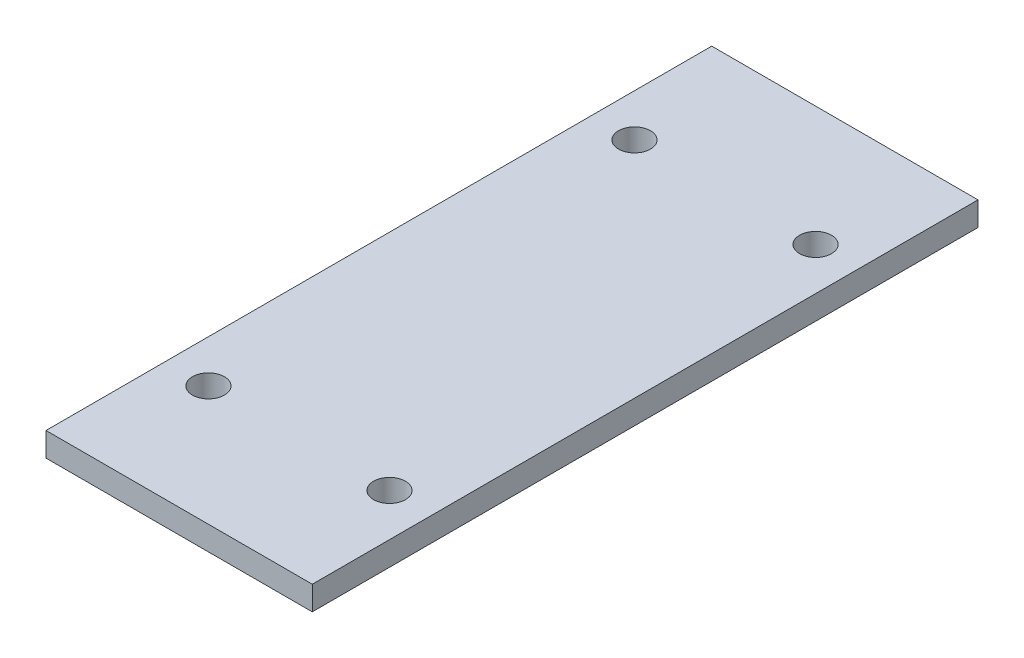
ISO-10303-21;
HEADER;
FILE_DESCRIPTION(('STEP AP214'),'2;1');
FILE_NAME('part.step','',(''),(''),'','','');
FILE_SCHEMA(('AUTOMOTIVE_DESIGN { 1 0 10303 214 1 1 1 1 }'));
ENDSEC;
DATA;
#1=APPLICATION_CONTEXT('core data for automotive mechanical design processes');
#2=APPLICATION_PROTOCOL_DEFINITION('international standard','automotive_design',2000,#1);
#3=PRODUCT_CONTEXT('',#1,'mechanical');
#4=PRODUCT('Part','Part','',(#3));
#5=PRODUCT_RELATED_PRODUCT_CATEGORY('part','',(#4));
#6=PRODUCT_DEFINITION_FORMATION('','',#4);
#7=PRODUCT_DEFINITION_CONTEXT('part definition',#1,'design');
#8=PRODUCT_DEFINITION('design','',#6,#7);
#9=PRODUCT_DEFINITION_SHAPE('','',#8);
#10=(LENGTH_UNIT() NAMED_UNIT(*) SI_UNIT(.MILLI.,.METRE.));
#11=(NAMED_UNIT(*) PLANE_ANGLE_UNIT() SI_UNIT($,.RADIAN.));
#12=(NAMED_UNIT(*) SI_UNIT($,.STERADIAN.) SOLID_ANGLE_UNIT());
#13=UNCERTAINTY_MEASURE_WITH_UNIT(LENGTH_MEASURE(1.E-05),#10,'distance_accuracy_value','');
#14=(GEOMETRIC_REPRESENTATION_CONTEXT(3) GLOBAL_UNCERTAINTY_ASSIGNED_CONTEXT((#13)) GLOBAL_UNIT_ASSIGNED_CONTEXT((#10,
#11,#12)) REPRESENTATION_CONTEXT('',''));
#15=CARTESIAN_POINT('',(0.,0.,0.));
#16=DIRECTION('',(0.,0.,1.));
#17=DIRECTION('',(1.,0.,0.));
#18=AXIS2_PLACEMENT_3D('',#15,#16,#17);
#19=CARTESIAN_POINT('',(0.,0.,250.));
#20=DIRECTION('',(1.,0.,0.));
#21=DIRECTION('',(0.,0.,-1.));
#22=AXIS2_PLACEMENT_3D('',#19,#20,#21);
#23=PLANE('',#22);
#24=DIRECTION('',(0.,-1.,0.));
#25=VECTOR('',#24,1.);
#26=CARTESIAN_POINT('',(0.,0.,0.));
#27=LINE('',#26,#25);
#28=CARTESIAN_POINT('',(0.,0.,0.));
#29=VERTEX_POINT('',#28);
#30=CARTESIAN_POINT('',(0.,-9.,0.));
#31=VERTEX_POINT('',#30);
#32=EDGE_CURVE('E107',#29,#31,#27,.T.);
#33=ORIENTED_EDGE('',*,*,#32,.T.);
#34=DIRECTION('',(0.,0.,-1.));
#35=VECTOR('',#34,1.);
#36=CARTESIAN_POINT('',(0.,-9.,250.));
#37=LINE('',#36,#35);
#38=CARTESIAN_POINT('',(0.,-9.,250.));
#39=VERTEX_POINT('',#38);
#40=EDGE_CURVE('E11',#39,#31,#37,.T.);
#41=ORIENTED_EDGE('',*,*,#40,.F.);
#42=DIRECTION('',(0.,-1.,0.));
#43=VECTOR('',#42,1.);
#44=CARTESIAN_POINT('',(0.,0.,250.));
#45=LINE('',#44,#43);
#46=CARTESIAN_POINT('',(0.,0.,250.));
#47=VERTEX_POINT('',#46);
#48=EDGE_CURVE('E89',#47,#39,#45,.T.);
#49=ORIENTED_EDGE('',*,*,#48,.F.);
#50=DIRECTION('',(0.,0.,-1.));
#51=VECTOR('',#50,1.);
#52=CARTESIAN_POINT('',(0.,0.,250.));
#53=LINE('',#52,#51);
#54=EDGE_CURVE('E56',#47,#29,#53,.T.);
#55=ORIENTED_EDGE('',*,*,#54,.T.);
#56=EDGE_LOOP('',(#33,#41,#49,#55));
#57=FACE_BOUND('',#56,.T.);
#58=ADVANCED_FACE('F39',(#57),#23,.F.);
#59=CARTESIAN_POINT('',(0.,-9.,250.));
#60=DIRECTION('',(0.,1.,0.));
#61=DIRECTION('',(0.,0.,1.));
#62=AXIS2_PLACEMENT_3D('',#59,#60,#61);
#63=PLANE('',#62);
#64=CARTESIAN_POINT('',(84.,-9.,45.));
#65=DIRECTION('',(0.,1.,0.));
#66=DIRECTION('',(0.,0.,1.));
#67=AXIS2_PLACEMENT_3D('',#64,#65,#66);
#68=CIRCLE('',#67,6.);
#69=CARTESIAN_POINT('',(84.,-9.,51.));
#70=VERTEX_POINT('',#69);
#71=EDGE_CURVE('E130',#70,#70,#68,.T.);
#72=ORIENTED_EDGE('',*,*,#71,.T.);
#73=EDGE_LOOP('',(#72));
#74=FACE_BOUND('',#73,.T.);
#75=CARTESIAN_POINT('',(16.,-9.,205.));
#76=DIRECTION('',(0.,1.,0.));
#77=DIRECTION('',(0.,0.,1.));
#78=AXIS2_PLACEMENT_3D('',#75,#76,#77);
#79=CIRCLE('',#78,6.);
#80=CARTESIAN_POINT('',(16.,-9.,211.));
#81=VERTEX_POINT('',#80);
#82=EDGE_CURVE('E138',#81,#81,#79,.T.);
#83=ORIENTED_EDGE('',*,*,#82,.T.);
#84=EDGE_LOOP('',(#83));
#85=FACE_BOUND('',#84,.T.);
#86=CARTESIAN_POINT('',(84.,-9.,205.));
#87=DIRECTION('',(0.,1.,0.));
#88=DIRECTION('',(0.,0.,1.));
#89=AXIS2_PLACEMENT_3D('',#86,#87,#88);
#90=CIRCLE('',#89,6.);
#91=CARTESIAN_POINT('',(84.,-9.,211.));
#92=VERTEX_POINT('',#91);
#93=EDGE_CURVE('E139',#92,#92,#90,.T.);
#94=ORIENTED_EDGE('',*,*,#93,.T.);
#95=EDGE_LOOP('',(#94));
#96=FACE_BOUND('',#95,.T.);
#97=CARTESIAN_POINT('',(16.,-9.,45.));
#98=DIRECTION('',(0.,1.,0.));
#99=DIRECTION('',(0.,0.,1.));
#100=AXIS2_PLACEMENT_3D('',#97,#98,#99);
#101=CIRCLE('',#100,6.);
#102=CARTESIAN_POINT('',(16.,-9.,51.));
#103=VERTEX_POINT('',#102);
#104=EDGE_CURVE('E110',#103,#103,#101,.T.);
#105=ORIENTED_EDGE('',*,*,#104,.T.);
#106=EDGE_LOOP('',(#105));
#107=FACE_BOUND('',#106,.T.);
#108=DIRECTION('',(1.,0.,0.));
#109=VECTOR('',#108,1.);
#110=CARTESIAN_POINT('',(0.,-9.,0.));
#111=LINE('',#110,#109);
#112=CARTESIAN_POINT('',(100.,-9.,0.));
#113=VERTEX_POINT('',#112);
#114=EDGE_CURVE('E95',#31,#113,#111,.T.);
#115=ORIENTED_EDGE('',*,*,#114,.T.);
#116=DIRECTION('',(0.,0.,-1.));
#117=VECTOR('',#116,1.);
#118=CARTESIAN_POINT('',(100.,-9.,250.));
#119=LINE('',#118,#117);
#120=CARTESIAN_POINT('',(100.,-9.,250.));
#121=VERTEX_POINT('',#120);
#122=EDGE_CURVE('E48',#121,#113,#119,.T.);
#123=ORIENTED_EDGE('',*,*,#122,.F.);
#124=DIRECTION('',(1.,0.,0.));
#125=VECTOR('',#124,1.);
#126=CARTESIAN_POINT('',(0.,-9.,250.));
#127=LINE('',#126,#125);
#128=EDGE_CURVE('E81',#39,#121,#127,.T.);
#129=ORIENTED_EDGE('',*,*,#128,.F.);
#130=ORIENTED_EDGE('',*,*,#40,.T.);
#131=EDGE_LOOP('',(#115,#123,#129,#130));
#132=FACE_BOUND('',#131,.T.);
#133=ADVANCED_FACE('F94',(#74,#85,#96,#107,#132),#63,.F.);
#134=CARTESIAN_POINT('',(100.,0.,250.));
#135=DIRECTION('',(1.,0.,0.));
#136=DIRECTION('',(0.,0.,-1.));
#137=AXIS2_PLACEMENT_3D('',#134,#135,#136);
#138=PLANE('',#137);
#139=DIRECTION('',(0.,-1.,0.));
#140=VECTOR('',#139,1.);
#141=CARTESIAN_POINT('',(100.,0.,0.));
#142=LINE('',#141,#140);
#143=CARTESIAN_POINT('',(100.,0.,0.));
#144=VERTEX_POINT('',#143);
#145=EDGE_CURVE('E113',#144,#113,#142,.T.);
#146=ORIENTED_EDGE('',*,*,#145,.F.);
#147=DIRECTION('',(0.,0.,-1.));
#148=VECTOR('',#147,1.);
#149=CARTESIAN_POINT('',(100.,0.,250.));
#150=LINE('',#149,#148);
#151=CARTESIAN_POINT('',(100.,0.,250.));
#152=VERTEX_POINT('',#151);
#153=EDGE_CURVE('E70',#152,#144,#150,.T.);
#154=ORIENTED_EDGE('',*,*,#153,.F.);
#155=DIRECTION('',(0.,-1.,0.));
#156=VECTOR('',#155,1.);
#157=CARTESIAN_POINT('',(100.,0.,250.));
#158=LINE('',#157,#156);
#159=EDGE_CURVE('E88',#152,#121,#158,.T.);
#160=ORIENTED_EDGE('',*,*,#159,.T.);
#161=ORIENTED_EDGE('',*,*,#122,.T.);
#162=EDGE_LOOP('',(#146,#154,#160,#161));
#163=FACE_BOUND('',#162,.T.);
#164=ADVANCED_FACE('F99',(#163),#138,.T.);
#165=CARTESIAN_POINT('',(0.,0.,250.));
#166=DIRECTION('',(0.,1.,0.));
#167=DIRECTION('',(0.,0.,1.));
#168=AXIS2_PLACEMENT_3D('',#165,#166,#167);
#169=PLANE('',#168);
#170=CARTESIAN_POINT('',(84.,0.,45.));
#171=DIRECTION('',(0.,1.,0.));
#172=DIRECTION('',(0.,0.,1.));
#173=AXIS2_PLACEMENT_3D('',#170,#171,#172);
#174=CIRCLE('',#173,6.);
#175=CARTESIAN_POINT('',(84.,0.,51.));
#176=VERTEX_POINT('',#175);
#177=EDGE_CURVE('E143',#176,#176,#174,.T.);
#178=ORIENTED_EDGE('',*,*,#177,.F.);
#179=EDGE_LOOP('',(#178));
#180=FACE_BOUND('',#179,.T.);
#181=CARTESIAN_POINT('',(16.,0.,205.));
#182=DIRECTION('',(0.,1.,0.));
#183=DIRECTION('',(0.,0.,1.));
#184=AXIS2_PLACEMENT_3D('',#181,#182,#183);
#185=CIRCLE('',#184,6.);
#186=CARTESIAN_POINT('',(16.,0.,211.));
#187=VERTEX_POINT('',#186);
#188=EDGE_CURVE('E134',#187,#187,#185,.T.);
#189=ORIENTED_EDGE('',*,*,#188,.F.);
#190=EDGE_LOOP('',(#189));
#191=FACE_BOUND('',#190,.T.);
#192=CARTESIAN_POINT('',(84.,0.,205.));
#193=DIRECTION('',(0.,1.,0.));
#194=DIRECTION('',(0.,0.,1.));
#195=AXIS2_PLACEMENT_3D('',#192,#193,#194);
#196=CIRCLE('',#195,6.);
#197=CARTESIAN_POINT('',(84.,0.,211.));
#198=VERTEX_POINT('',#197);
#199=EDGE_CURVE('E150',#198,#198,#196,.T.);
#200=ORIENTED_EDGE('',*,*,#199,.F.);
#201=EDGE_LOOP('',(#200));
#202=FACE_BOUND('',#201,.T.);
#203=CARTESIAN_POINT('',(16.,0.,45.));
#204=DIRECTION('',(0.,1.,0.));
#205=DIRECTION('',(0.,0.,1.));
#206=AXIS2_PLACEMENT_3D('',#203,#204,#205);
#207=CIRCLE('',#206,6.);
#208=CARTESIAN_POINT('',(16.,0.,51.));
#209=VERTEX_POINT('',#208);
#210=EDGE_CURVE('E126',#209,#209,#207,.T.);
#211=ORIENTED_EDGE('',*,*,#210,.F.);
#212=EDGE_LOOP('',(#211));
#213=FACE_BOUND('',#212,.T.);
#214=DIRECTION('',(1.,0.,0.));
#215=VECTOR('',#214,1.);
#216=CARTESIAN_POINT('',(0.,0.,0.));
#217=LINE('',#216,#215);
#218=EDGE_CURVE('E116',#29,#144,#217,.T.);
#219=ORIENTED_EDGE('',*,*,#218,.F.);
#220=ORIENTED_EDGE('',*,*,#54,.F.);
#221=DIRECTION('',(1.,0.,0.));
#222=VECTOR('',#221,1.);
#223=CARTESIAN_POINT('',(0.,0.,250.));
#224=LINE('',#223,#222);
#225=EDGE_CURVE('E101',#47,#152,#224,.T.);
#226=ORIENTED_EDGE('',*,*,#225,.T.);
#227=ORIENTED_EDGE('',*,*,#153,.T.);
#228=EDGE_LOOP('',(#219,#220,#226,#227));
#229=FACE_BOUND('',#228,.T.);
#230=ADVANCED_FACE('F168',(#180,#191,#202,#213,#229),#169,.T.);
#231=CARTESIAN_POINT('',(0.,0.,250.));
#232=DIRECTION('',(0.,0.,1.));
#233=DIRECTION('',(1.,0.,0.));
#234=AXIS2_PLACEMENT_3D('',#231,#232,#233);
#235=PLANE('',#234);
#236=ORIENTED_EDGE('',*,*,#48,.T.);
#237=ORIENTED_EDGE('',*,*,#128,.T.);
#238=ORIENTED_EDGE('',*,*,#159,.F.);
#239=ORIENTED_EDGE('',*,*,#225,.F.);
#240=EDGE_LOOP('',(#236,#237,#238,#239));
#241=FACE_BOUND('',#240,.T.);
#242=ADVANCED_FACE('F85',(#241),#235,.T.);
#243=CARTESIAN_POINT('',(0.,0.,0.));
#244=DIRECTION('',(0.,0.,1.));
#245=DIRECTION('',(1.,0.,0.));
#246=AXIS2_PLACEMENT_3D('',#243,#244,#245);
#247=PLANE('',#246);
#248=ORIENTED_EDGE('',*,*,#32,.F.);
#249=ORIENTED_EDGE('',*,*,#218,.T.);
#250=ORIENTED_EDGE('',*,*,#145,.T.);
#251=ORIENTED_EDGE('',*,*,#114,.F.);
#252=EDGE_LOOP('',(#248,#249,#250,#251));
#253=FACE_BOUND('',#252,.T.);
#254=ADVANCED_FACE('F176',(#253),#247,.F.);
#255=CARTESIAN_POINT('',(16.,-9.,45.));
#256=DIRECTION('',(0.,1.,0.));
#257=DIRECTION('',(0.,0.,1.));
#258=AXIS2_PLACEMENT_3D('',#255,#256,#257);
#259=CYLINDRICAL_SURFACE('',#258,6.);
#260=ORIENTED_EDGE('',*,*,#104,.F.);
#261=EDGE_LOOP('',(#260));
#262=FACE_BOUND('',#261,.T.);
#263=ORIENTED_EDGE('',*,*,#210,.T.);
#264=EDGE_LOOP('',(#263));
#265=FACE_BOUND('',#264,.T.);
#266=ADVANCED_FACE('F164',(#262,#265),#259,.F.);
#267=CARTESIAN_POINT('',(84.,-9.,205.));
#268=DIRECTION('',(0.,1.,0.));
#269=DIRECTION('',(0.,0.,1.));
#270=AXIS2_PLACEMENT_3D('',#267,#268,#269);
#271=CYLINDRICAL_SURFACE('',#270,6.);
#272=ORIENTED_EDGE('',*,*,#93,.F.);
#273=EDGE_LOOP('',(#272));
#274=FACE_BOUND('',#273,.T.);
#275=ORIENTED_EDGE('',*,*,#199,.T.);
#276=EDGE_LOOP('',(#275));
#277=FACE_BOUND('',#276,.T.);
#278=ADVANCED_FACE('F160',(#274,#277),#271,.F.);
#279=CARTESIAN_POINT('',(16.,-9.,205.));
#280=DIRECTION('',(0.,1.,0.));
#281=DIRECTION('',(0.,0.,1.));
#282=AXIS2_PLACEMENT_3D('',#279,#280,#281);
#283=CYLINDRICAL_SURFACE('',#282,6.);
#284=ORIENTED_EDGE('',*,*,#82,.F.);
#285=EDGE_LOOP('',(#284));
#286=FACE_BOUND('',#285,.T.);
#287=ORIENTED_EDGE('',*,*,#188,.T.);
#288=EDGE_LOOP('',(#287));
#289=FACE_BOUND('',#288,.T.);
#290=ADVANCED_FACE('F163',(#286,#289),#283,.F.);
#291=CARTESIAN_POINT('',(84.,-9.,45.));
#292=DIRECTION('',(0.,1.,0.));
#293=DIRECTION('',(0.,0.,1.));
#294=AXIS2_PLACEMENT_3D('',#291,#292,#293);
#295=CYLINDRICAL_SURFACE('',#294,6.);
#296=ORIENTED_EDGE('',*,*,#71,.F.);
#297=EDGE_LOOP('',(#296));
#298=FACE_BOUND('',#297,.T.);
#299=ORIENTED_EDGE('',*,*,#177,.T.);
#300=EDGE_LOOP('',(#299));
#301=FACE_BOUND('',#300,.T.);
#302=ADVANCED_FACE('F235',(#298,#301),#295,.F.);
#303=CLOSED_SHELL('',(#58,#133,#164,#230,#242,#254,#266,#278,#290,#302));
#304=MANIFOLD_SOLID_BREP('B2',#303);
#305=ADVANCED_BREP_SHAPE_REPRESENTATION('',(#18,#304),#14);
#306=SHAPE_DEFINITION_REPRESENTATION(#9,#305);
ENDSEC;
END-ISO-10303-21;
